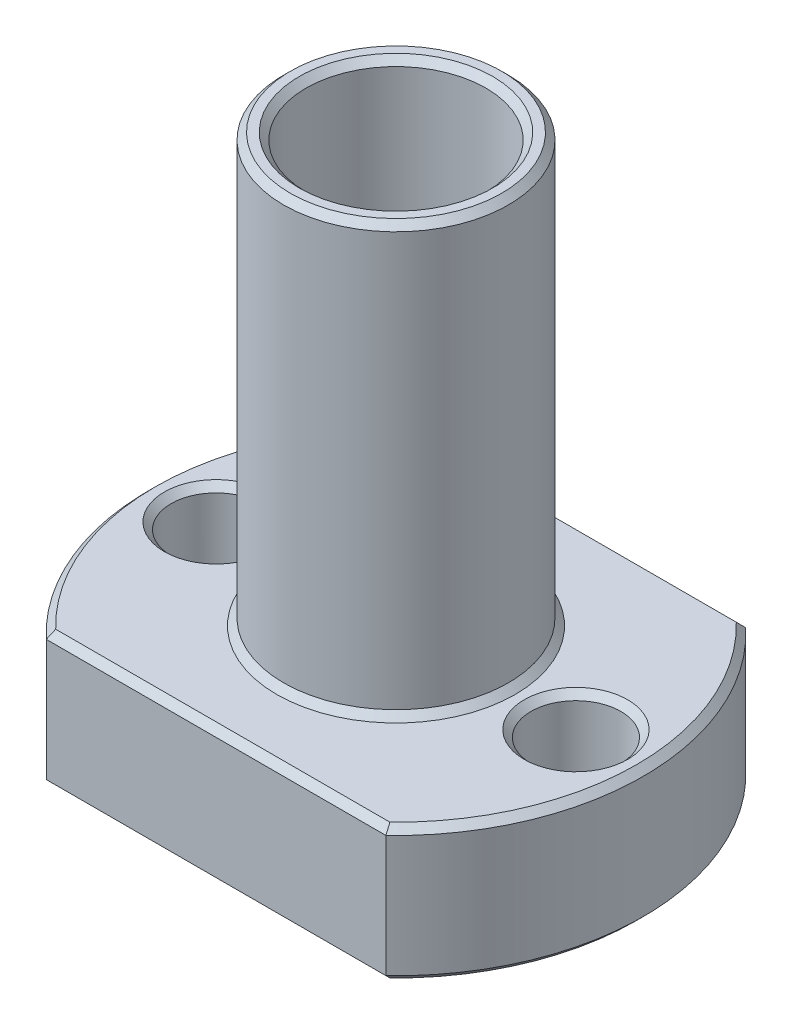
ISO-10303-21;
HEADER;
FILE_DESCRIPTION(('STEP AP214'),'2;1');
FILE_NAME('part.step','',(''),(''),'','','');
FILE_SCHEMA(('AUTOMOTIVE_DESIGN { 1 0 10303 214 1 1 1 1 }'));
ENDSEC;
DATA;
#1=APPLICATION_CONTEXT('core data for automotive mechanical design processes');
#2=APPLICATION_PROTOCOL_DEFINITION('international standard','automotive_design',2000,#1);
#3=PRODUCT_CONTEXT('',#1,'mechanical');
#4=PRODUCT('Part','Part','',(#3));
#5=PRODUCT_RELATED_PRODUCT_CATEGORY('part','',(#4));
#6=PRODUCT_DEFINITION_FORMATION('','',#4);
#7=PRODUCT_DEFINITION_CONTEXT('part definition',#1,'design');
#8=PRODUCT_DEFINITION('design','',#6,#7);
#9=PRODUCT_DEFINITION_SHAPE('','',#8);
#10=(LENGTH_UNIT() NAMED_UNIT(*) SI_UNIT(.MILLI.,.METRE.));
#11=(NAMED_UNIT(*) PLANE_ANGLE_UNIT() SI_UNIT($,.RADIAN.));
#12=(NAMED_UNIT(*) SI_UNIT($,.STERADIAN.) SOLID_ANGLE_UNIT());
#13=UNCERTAINTY_MEASURE_WITH_UNIT(LENGTH_MEASURE(1.E-05),#10,'distance_accuracy_value','');
#14=(GEOMETRIC_REPRESENTATION_CONTEXT(3) GLOBAL_UNCERTAINTY_ASSIGNED_CONTEXT((#13)) GLOBAL_UNIT_ASSIGNED_CONTEXT((#10,
#11,#12)) REPRESENTATION_CONTEXT('',''));
#15=CARTESIAN_POINT('',(0.,0.,0.));
#16=DIRECTION('',(0.,0.,1.));
#17=DIRECTION('',(1.,0.,0.));
#18=AXIS2_PLACEMENT_3D('',#15,#16,#17);
#19=CARTESIAN_POINT('',(0.,6.,0.));
#20=DIRECTION('',(0.,1.,0.));
#21=DIRECTION('',(0.,0.,1.));
#22=AXIS2_PLACEMENT_3D('',#19,#20,#21);
#23=PLANE('',#22);
#24=CARTESIAN_POINT('',(0.,6.,0.));
#25=DIRECTION('',(0.,1.,0.));
#26=DIRECTION('',(0.,0.,1.));
#27=AXIS2_PLACEMENT_3D('',#24,#25,#26);
#28=CIRCLE('',#27,5.3);
#29=CARTESIAN_POINT('',(0.,6.,5.3));
#30=VERTEX_POINT('',#29);
#31=EDGE_CURVE('E11',#30,#30,#28,.F.);
#32=ORIENTED_EDGE('',*,*,#31,.T.);
#33=EDGE_LOOP('',(#32));
#34=FACE_BOUND('',#33,.T.);
#35=CARTESIAN_POINT('',(-8.,6.,0.));
#36=DIRECTION('',(0.,1.,0.));
#37=DIRECTION('',(0.,0.,1.));
#38=AXIS2_PLACEMENT_3D('',#35,#36,#37);
#39=CIRCLE('',#38,2.29999999999999);
#40=CARTESIAN_POINT('',(-8.,6.,2.29999999999999));
#41=VERTEX_POINT('',#40);
#42=EDGE_CURVE('E46',#41,#41,#39,.F.);
#43=ORIENTED_EDGE('',*,*,#42,.T.);
#44=EDGE_LOOP('',(#43));
#45=FACE_BOUND('',#44,.T.);
#46=CARTESIAN_POINT('',(0.,6.,0.));
#47=DIRECTION('',(0.,1.,0.));
#48=DIRECTION('',(0.,0.,1.));
#49=AXIS2_PLACEMENT_3D('',#46,#47,#48);
#50=CIRCLE('',#49,10.7);
#51=CARTESIAN_POINT('',(-7.42967024840268,6.,-7.7));
#52=VERTEX_POINT('',#51);
#53=CARTESIAN_POINT('',(-7.42967024840269,6.,7.7));
#54=VERTEX_POINT('',#53);
#55=EDGE_CURVE('E54',#52,#54,#50,.T.);
#56=ORIENTED_EDGE('',*,*,#55,.T.);
#57=DIRECTION('',(1.,0.,0.));
#58=VECTOR('',#57,1.);
#59=CARTESIAN_POINT('',(7.54983443527075,6.,7.7));
#60=LINE('',#59,#58);
#61=CARTESIAN_POINT('',(7.42967024840268,6.,7.7));
#62=VERTEX_POINT('',#61);
#63=EDGE_CURVE('E195',#54,#62,#60,.T.);
#64=ORIENTED_EDGE('',*,*,#63,.T.);
#65=CARTESIAN_POINT('',(0.,6.,0.));
#66=DIRECTION('',(0.,1.,0.));
#67=DIRECTION('',(0.,0.,1.));
#68=AXIS2_PLACEMENT_3D('',#65,#66,#67);
#69=CIRCLE('',#68,10.7);
#70=CARTESIAN_POINT('',(7.42967024840268,6.,-7.7));
#71=VERTEX_POINT('',#70);
#72=EDGE_CURVE('E191',#62,#71,#69,.T.);
#73=ORIENTED_EDGE('',*,*,#72,.T.);
#74=DIRECTION('',(-1.,0.,0.));
#75=VECTOR('',#74,1.);
#76=CARTESIAN_POINT('',(-7.54983443527075,6.,-7.7));
#77=LINE('',#76,#75);
#78=EDGE_CURVE('E59',#71,#52,#77,.T.);
#79=ORIENTED_EDGE('',*,*,#78,.T.);
#80=EDGE_LOOP('',(#56,#64,#73,#79));
#81=FACE_BOUND('',#80,.T.);
#82=CARTESIAN_POINT('',(8.,6.,0.));
#83=DIRECTION('',(0.,1.,0.));
#84=DIRECTION('',(0.,0.,1.));
#85=AXIS2_PLACEMENT_3D('',#82,#83,#84);
#86=CIRCLE('',#85,2.29999999999999);
#87=CARTESIAN_POINT('',(8.,6.,2.29999999999999));
#88=VERTEX_POINT('',#87);
#89=EDGE_CURVE('E188',#88,#88,#86,.F.);
#90=ORIENTED_EDGE('',*,*,#89,.T.);
#91=EDGE_LOOP('',(#90));
#92=FACE_BOUND('',#91,.T.);
#93=ADVANCED_FACE('F33',(#34,#45,#81,#92),#23,.T.);
#94=CARTESIAN_POINT('',(0.,0.,0.));
#95=DIRECTION('',(0.,1.,0.));
#96=DIRECTION('',(0.,0.,1.));
#97=AXIS2_PLACEMENT_3D('',#94,#95,#96);
#98=PLANE('',#97);
#99=CARTESIAN_POINT('',(8.,0.,0.));
#100=DIRECTION('',(0.,1.,0.));
#101=DIRECTION('',(0.,0.,1.));
#102=AXIS2_PLACEMENT_3D('',#99,#100,#101);
#103=CIRCLE('',#102,2.3);
#104=CARTESIAN_POINT('',(8.,0.,2.3));
#105=VERTEX_POINT('',#104);
#106=EDGE_CURVE('E135',#105,#105,#103,.T.);
#107=ORIENTED_EDGE('',*,*,#106,.T.);
#108=EDGE_LOOP('',(#107));
#109=FACE_BOUND('',#108,.T.);
#110=CARTESIAN_POINT('',(0.,0.,0.));
#111=DIRECTION('',(0.,1.,0.));
#112=DIRECTION('',(0.,0.,1.));
#113=AXIS2_PLACEMENT_3D('',#110,#111,#112);
#114=CIRCLE('',#113,4.3);
#115=CARTESIAN_POINT('',(0.,0.,4.3));
#116=VERTEX_POINT('',#115);
#117=EDGE_CURVE('E132',#116,#116,#114,.T.);
#118=ORIENTED_EDGE('',*,*,#117,.T.);
#119=EDGE_LOOP('',(#118));
#120=FACE_BOUND('',#119,.T.);
#121=CARTESIAN_POINT('',(0.,0.,0.));
#122=DIRECTION('',(0.,1.,0.));
#123=DIRECTION('',(0.,0.,1.));
#124=AXIS2_PLACEMENT_3D('',#121,#122,#123);
#125=CIRCLE('',#124,10.7);
#126=CARTESIAN_POINT('',(-7.42967024840269,0.,7.7));
#127=VERTEX_POINT('',#126);
#128=CARTESIAN_POINT('',(-7.42967024840268,0.,-7.7));
#129=VERTEX_POINT('',#128);
#130=EDGE_CURVE('E131',#127,#129,#125,.F.);
#131=ORIENTED_EDGE('',*,*,#130,.T.);
#132=DIRECTION('',(1.,0.,0.));
#133=VECTOR('',#132,1.);
#134=CARTESIAN_POINT('',(0.,0.,-7.7));
#135=LINE('',#134,#133);
#136=CARTESIAN_POINT('',(7.42967024840268,0.,-7.7));
#137=VERTEX_POINT('',#136);
#138=EDGE_CURVE('E109',#129,#137,#135,.T.);
#139=ORIENTED_EDGE('',*,*,#138,.T.);
#140=CARTESIAN_POINT('',(0.,0.,0.));
#141=DIRECTION('',(0.,1.,0.));
#142=DIRECTION('',(0.,0.,1.));
#143=AXIS2_PLACEMENT_3D('',#140,#141,#142);
#144=CIRCLE('',#143,10.7);
#145=CARTESIAN_POINT('',(7.42967024840268,0.,7.7));
#146=VERTEX_POINT('',#145);
#147=EDGE_CURVE('E119',#137,#146,#144,.F.);
#148=ORIENTED_EDGE('',*,*,#147,.T.);
#149=DIRECTION('',(-1.,0.,0.));
#150=VECTOR('',#149,1.);
#151=CARTESIAN_POINT('',(0.,0.,7.7));
#152=LINE('',#151,#150);
#153=EDGE_CURVE('E125',#146,#127,#152,.T.);
#154=ORIENTED_EDGE('',*,*,#153,.T.);
#155=EDGE_LOOP('',(#131,#139,#148,#154));
#156=FACE_BOUND('',#155,.T.);
#157=CARTESIAN_POINT('',(-8.,0.,0.));
#158=DIRECTION('',(0.,1.,0.));
#159=DIRECTION('',(0.,0.,1.));
#160=AXIS2_PLACEMENT_3D('',#157,#158,#159);
#161=CIRCLE('',#160,2.3);
#162=CARTESIAN_POINT('',(-8.,0.,-2.3));
#163=VERTEX_POINT('',#162);
#164=EDGE_CURVE('E126',#163,#163,#161,.T.);
#165=ORIENTED_EDGE('',*,*,#164,.T.);
#166=EDGE_LOOP('',(#165));
#167=FACE_BOUND('',#166,.T.);
#168=ADVANCED_FACE('F128',(#109,#120,#156,#167),#98,.F.);
#169=CARTESIAN_POINT('',(0.,6.,0.));
#170=DIRECTION('',(0.,-1.,0.));
#171=DIRECTION('',(0.,0.,-1.));
#172=AXIS2_PLACEMENT_3D('',#169,#170,#171);
#173=CYLINDRICAL_SURFACE('',#172,11.);
#174=DIRECTION('',(0.,-1.,0.));
#175=VECTOR('',#174,1.);
#176=CARTESIAN_POINT('',(7.54983443527075,6.,8.));
#177=LINE('',#176,#175);
#178=CARTESIAN_POINT('',(7.54983443527075,5.7,8.));
#179=VERTEX_POINT('',#178);
#180=CARTESIAN_POINT('',(7.54983443527075,0.299999999999998,8.));
#181=VERTEX_POINT('',#180);
#182=EDGE_CURVE('E228',#179,#181,#177,.T.);
#183=ORIENTED_EDGE('',*,*,#182,.T.);
#184=CARTESIAN_POINT('',(0.,0.299999999999998,0.));
#185=DIRECTION('',(0.,1.,0.));
#186=DIRECTION('',(0.,0.,1.));
#187=AXIS2_PLACEMENT_3D('',#184,#185,#186);
#188=CIRCLE('',#187,11.);
#189=CARTESIAN_POINT('',(7.54983443527075,0.299999999999998,-8.));
#190=VERTEX_POINT('',#189);
#191=EDGE_CURVE('E168',#181,#190,#188,.T.);
#192=ORIENTED_EDGE('',*,*,#191,.T.);
#193=DIRECTION('',(0.,-1.,0.));
#194=VECTOR('',#193,1.);
#195=CARTESIAN_POINT('',(7.54983443527075,6.,-8.));
#196=LINE('',#195,#194);
#197=CARTESIAN_POINT('',(7.54983443527075,5.7,-8.));
#198=VERTEX_POINT('',#197);
#199=EDGE_CURVE('E291',#198,#190,#196,.T.);
#200=ORIENTED_EDGE('',*,*,#199,.F.);
#201=CARTESIAN_POINT('',(0.,5.7,0.));
#202=DIRECTION('',(0.,1.,0.));
#203=DIRECTION('',(0.,0.,1.));
#204=AXIS2_PLACEMENT_3D('',#201,#202,#203);
#205=CIRCLE('',#204,11.);
#206=EDGE_CURVE('E166',#198,#179,#205,.F.);
#207=ORIENTED_EDGE('',*,*,#206,.T.);
#208=EDGE_LOOP('',(#183,#192,#200,#207));
#209=FACE_BOUND('',#208,.T.);
#210=ADVANCED_FACE('F307',(#209),#173,.T.);
#211=CARTESIAN_POINT('',(7.54983443527075,6.,-8.));
#212=DIRECTION('',(0.,0.,1.));
#213=DIRECTION('',(1.,0.,0.));
#214=AXIS2_PLACEMENT_3D('',#211,#212,#213);
#215=PLANE('',#214);
#216=ORIENTED_EDGE('',*,*,#199,.T.);
#217=DIRECTION('',(-1.,0.,0.));
#218=VECTOR('',#217,1.);
#219=CARTESIAN_POINT('',(7.54983443527075,0.299999999999998,-8.));
#220=LINE('',#219,#218);
#221=CARTESIAN_POINT('',(-7.54983443527075,0.299999999999998,-8.));
#222=VERTEX_POINT('',#221);
#223=EDGE_CURVE('E112',#190,#222,#220,.T.);
#224=ORIENTED_EDGE('',*,*,#223,.T.);
#225=DIRECTION('',(0.,-1.,0.));
#226=VECTOR('',#225,1.);
#227=CARTESIAN_POINT('',(-7.54983443527075,6.,-8.));
#228=LINE('',#227,#226);
#229=CARTESIAN_POINT('',(-7.54983443527075,5.7,-8.));
#230=VERTEX_POINT('',#229);
#231=EDGE_CURVE('E289',#230,#222,#228,.T.);
#232=ORIENTED_EDGE('',*,*,#231,.F.);
#233=DIRECTION('',(1.,0.,0.));
#234=VECTOR('',#233,1.);
#235=CARTESIAN_POINT('',(7.54983443527075,5.7,-8.));
#236=LINE('',#235,#234);
#237=EDGE_CURVE('E154',#230,#198,#236,.T.);
#238=ORIENTED_EDGE('',*,*,#237,.T.);
#239=EDGE_LOOP('',(#216,#224,#232,#238));
#240=FACE_BOUND('',#239,.T.);
#241=ADVANCED_FACE('F303',(#240),#215,.F.);
#242=CARTESIAN_POINT('',(0.,6.,0.));
#243=DIRECTION('',(0.,-1.,0.));
#244=DIRECTION('',(0.,0.,-1.));
#245=AXIS2_PLACEMENT_3D('',#242,#243,#244);
#246=CYLINDRICAL_SURFACE('',#245,11.);
#247=ORIENTED_EDGE('',*,*,#231,.T.);
#248=CARTESIAN_POINT('',(0.,0.299999999999998,0.));
#249=DIRECTION('',(0.,1.,0.));
#250=DIRECTION('',(0.,0.,1.));
#251=AXIS2_PLACEMENT_3D('',#248,#249,#250);
#252=CIRCLE('',#251,11.);
#253=CARTESIAN_POINT('',(-7.54983443527076,0.299999999999998,7.99999999999999));
#254=VERTEX_POINT('',#253);
#255=EDGE_CURVE('E159',#222,#254,#252,.T.);
#256=ORIENTED_EDGE('',*,*,#255,.T.);
#257=DIRECTION('',(0.,-1.,0.));
#258=VECTOR('',#257,1.);
#259=CARTESIAN_POINT('',(-7.54983443527076,6.,7.99999999999999));
#260=LINE('',#259,#258);
#261=CARTESIAN_POINT('',(-7.54983443527076,5.7,7.99999999999999));
#262=VERTEX_POINT('',#261);
#263=EDGE_CURVE('E284',#262,#254,#260,.T.);
#264=ORIENTED_EDGE('',*,*,#263,.F.);
#265=CARTESIAN_POINT('',(0.,5.7,0.));
#266=DIRECTION('',(0.,1.,0.));
#267=DIRECTION('',(0.,0.,1.));
#268=AXIS2_PLACEMENT_3D('',#265,#266,#267);
#269=CIRCLE('',#268,11.);
#270=EDGE_CURVE('E157',#262,#230,#269,.F.);
#271=ORIENTED_EDGE('',*,*,#270,.T.);
#272=EDGE_LOOP('',(#247,#256,#264,#271));
#273=FACE_BOUND('',#272,.T.);
#274=ADVANCED_FACE('F287',(#273),#246,.T.);
#275=CARTESIAN_POINT('',(7.54983443527075,6.,8.));
#276=DIRECTION('',(0.,0.,-1.));
#277=DIRECTION('',(-1.,0.,0.));
#278=AXIS2_PLACEMENT_3D('',#275,#276,#277);
#279=PLANE('',#278);
#280=ORIENTED_EDGE('',*,*,#263,.T.);
#281=DIRECTION('',(1.,0.,0.));
#282=VECTOR('',#281,1.);
#283=CARTESIAN_POINT('',(7.54983443527075,0.299999999999998,8.));
#284=LINE('',#283,#282);
#285=EDGE_CURVE('E164',#254,#181,#284,.T.);
#286=ORIENTED_EDGE('',*,*,#285,.T.);
#287=ORIENTED_EDGE('',*,*,#182,.F.);
#288=DIRECTION('',(-1.,0.,0.));
#289=VECTOR('',#288,1.);
#290=CARTESIAN_POINT('',(-7.54983443527076,5.7,8.));
#291=LINE('',#290,#289);
#292=EDGE_CURVE('E161',#179,#262,#291,.T.);
#293=ORIENTED_EDGE('',*,*,#292,.T.);
#294=EDGE_LOOP('',(#280,#286,#287,#293));
#295=FACE_BOUND('',#294,.T.);
#296=ADVANCED_FACE('F283',(#295),#279,.F.);
#297=CARTESIAN_POINT('',(0.,6.,0.));
#298=DIRECTION('',(0.,-1.,0.));
#299=DIRECTION('',(0.,0.,-1.));
#300=AXIS2_PLACEMENT_3D('',#297,#298,#299);
#301=CYLINDRICAL_SURFACE('',#300,4.);
#302=CARTESIAN_POINT('',(0.,0.3,0.));
#303=DIRECTION('',(0.,1.,0.));
#304=DIRECTION('',(0.,0.,1.));
#305=AXIS2_PLACEMENT_3D('',#302,#303,#304);
#306=CIRCLE('',#305,4.);
#307=CARTESIAN_POINT('',(0.,0.3,4.));
#308=VERTEX_POINT('',#307);
#309=EDGE_CURVE('E151',#308,#308,#306,.F.);
#310=ORIENTED_EDGE('',*,*,#309,.T.);
#311=EDGE_LOOP('',(#310));
#312=FACE_BOUND('',#311,.T.);
#313=CARTESIAN_POINT('',(0.,24.7,0.));
#314=DIRECTION('',(0.,1.,0.));
#315=DIRECTION('',(0.,0.,1.));
#316=AXIS2_PLACEMENT_3D('',#313,#314,#315);
#317=CIRCLE('',#316,4.);
#318=CARTESIAN_POINT('',(0.,24.7,4.));
#319=VERTEX_POINT('',#318);
#320=EDGE_CURVE('E148',#319,#319,#317,.T.);
#321=ORIENTED_EDGE('',*,*,#320,.T.);
#322=EDGE_LOOP('',(#321));
#323=FACE_BOUND('',#322,.T.);
#324=ADVANCED_FACE('F331',(#312,#323),#301,.F.);
#325=CARTESIAN_POINT('',(-8.,6.,0.));
#326=DIRECTION('',(0.,-1.,0.));
#327=DIRECTION('',(0.,0.,-1.));
#328=AXIS2_PLACEMENT_3D('',#325,#326,#327);
#329=CYLINDRICAL_SURFACE('',#328,2.);
#330=CARTESIAN_POINT('',(-8.,0.300000000000005,0.));
#331=DIRECTION('',(0.,1.,0.));
#332=DIRECTION('',(0.,0.,1.));
#333=AXIS2_PLACEMENT_3D('',#330,#331,#332);
#334=CIRCLE('',#333,2.);
#335=CARTESIAN_POINT('',(-8.,0.300000000000005,-2.));
#336=VERTEX_POINT('',#335);
#337=EDGE_CURVE('E173',#336,#336,#334,.F.);
#338=ORIENTED_EDGE('',*,*,#337,.T.);
#339=EDGE_LOOP('',(#338));
#340=FACE_BOUND('',#339,.T.);
#341=CARTESIAN_POINT('',(-8.,5.70000000000001,0.));
#342=DIRECTION('',(0.,1.,0.));
#343=DIRECTION('',(0.,0.,1.));
#344=AXIS2_PLACEMENT_3D('',#341,#342,#343);
#345=CIRCLE('',#344,2.);
#346=CARTESIAN_POINT('',(-8.,5.70000000000001,2.));
#347=VERTEX_POINT('',#346);
#348=EDGE_CURVE('E170',#347,#347,#345,.T.);
#349=ORIENTED_EDGE('',*,*,#348,.T.);
#350=EDGE_LOOP('',(#349));
#351=FACE_BOUND('',#350,.T.);
#352=ADVANCED_FACE('F321',(#340,#351),#329,.F.);
#353=CARTESIAN_POINT('',(8.,6.,0.));
#354=DIRECTION('',(0.,-1.,0.));
#355=DIRECTION('',(0.,0.,-1.));
#356=AXIS2_PLACEMENT_3D('',#353,#354,#355);
#357=CYLINDRICAL_SURFACE('',#356,2.);
#358=CARTESIAN_POINT('',(8.,0.300000000000007,0.));
#359=DIRECTION('',(0.,1.,0.));
#360=DIRECTION('',(0.,0.,1.));
#361=AXIS2_PLACEMENT_3D('',#358,#359,#360);
#362=CIRCLE('',#361,2.);
#363=CARTESIAN_POINT('',(8.,0.300000000000007,2.));
#364=VERTEX_POINT('',#363);
#365=EDGE_CURVE('E145',#364,#364,#362,.F.);
#366=ORIENTED_EDGE('',*,*,#365,.T.);
#367=EDGE_LOOP('',(#366));
#368=FACE_BOUND('',#367,.T.);
#369=CARTESIAN_POINT('',(8.,5.70000000000001,0.));
#370=DIRECTION('',(0.,1.,0.));
#371=DIRECTION('',(0.,0.,1.));
#372=AXIS2_PLACEMENT_3D('',#369,#370,#371);
#373=CIRCLE('',#372,2.);
#374=CARTESIAN_POINT('',(8.,5.70000000000001,2.));
#375=VERTEX_POINT('',#374);
#376=EDGE_CURVE('E142',#375,#375,#373,.T.);
#377=ORIENTED_EDGE('',*,*,#376,.T.);
#378=EDGE_LOOP('',(#377));
#379=FACE_BOUND('',#378,.T.);
#380=ADVANCED_FACE('F318',(#368,#379),#357,.F.);
#381=CARTESIAN_POINT('',(0.,25.,0.));
#382=DIRECTION('',(0.,1.,0.));
#383=DIRECTION('',(0.,0.,1.));
#384=AXIS2_PLACEMENT_3D('',#381,#382,#383);
#385=PLANE('',#384);
#386=CARTESIAN_POINT('',(0.,25.,0.));
#387=DIRECTION('',(0.,1.,0.));
#388=DIRECTION('',(0.,0.,1.));
#389=AXIS2_PLACEMENT_3D('',#386,#387,#388);
#390=CIRCLE('',#389,4.3);
#391=CARTESIAN_POINT('',(0.,25.,4.3));
#392=VERTEX_POINT('',#391);
#393=EDGE_CURVE('E179',#392,#392,#390,.F.);
#394=ORIENTED_EDGE('',*,*,#393,.T.);
#395=EDGE_LOOP('',(#394));
#396=FACE_BOUND('',#395,.T.);
#397=CARTESIAN_POINT('',(0.,25.,0.));
#398=DIRECTION('',(0.,1.,0.));
#399=DIRECTION('',(0.,0.,1.));
#400=AXIS2_PLACEMENT_3D('',#397,#398,#399);
#401=CIRCLE('',#400,4.7);
#402=CARTESIAN_POINT('',(0.,25.,4.7));
#403=VERTEX_POINT('',#402);
#404=EDGE_CURVE('E176',#403,#403,#401,.T.);
#405=ORIENTED_EDGE('',*,*,#404,.T.);
#406=EDGE_LOOP('',(#405));
#407=FACE_BOUND('',#406,.T.);
#408=ADVANCED_FACE('F320',(#396,#407),#385,.T.);
#409=CARTESIAN_POINT('',(0.,25.,0.));
#410=DIRECTION('',(0.,-1.,0.));
#411=DIRECTION('',(0.,0.,-1.));
#412=AXIS2_PLACEMENT_3D('',#409,#410,#411);
#413=CYLINDRICAL_SURFACE('',#412,5.);
#414=CARTESIAN_POINT('',(0.,24.7,0.));
#415=DIRECTION('',(0.,1.,0.));
#416=DIRECTION('',(0.,0.,1.));
#417=AXIS2_PLACEMENT_3D('',#414,#415,#416);
#418=CIRCLE('',#417,5.);
#419=CARTESIAN_POINT('',(0.,24.7,5.));
#420=VERTEX_POINT('',#419);
#421=EDGE_CURVE('E185',#420,#420,#418,.F.);
#422=ORIENTED_EDGE('',*,*,#421,.T.);
#423=EDGE_LOOP('',(#422));
#424=FACE_BOUND('',#423,.T.);
#425=CARTESIAN_POINT('',(0.,6.30000000000001,0.));
#426=DIRECTION('',(0.,1.,0.));
#427=DIRECTION('',(0.,0.,1.));
#428=AXIS2_PLACEMENT_3D('',#425,#426,#427);
#429=CIRCLE('',#428,5.);
#430=CARTESIAN_POINT('',(0.,6.30000000000001,5.));
#431=VERTEX_POINT('',#430);
#432=EDGE_CURVE('E182',#431,#431,#429,.T.);
#433=ORIENTED_EDGE('',*,*,#432,.T.);
#434=EDGE_LOOP('',(#433));
#435=FACE_BOUND('',#434,.T.);
#436=ADVANCED_FACE('F328',(#424,#435),#413,.T.);
#437=CARTESIAN_POINT('',(8.,0.,0.));
#438=DIRECTION('',(0.,-1.,0.));
#439=DIRECTION('',(0.,0.,-1.));
#440=AXIS2_PLACEMENT_3D('',#437,#438,#439);
#441=CONICAL_SURFACE('',#440,2.3,0.785398163397443);
#442=ORIENTED_EDGE('',*,*,#365,.F.);
#443=EDGE_LOOP('',(#442));
#444=FACE_BOUND('',#443,.T.);
#445=ORIENTED_EDGE('',*,*,#106,.F.);
#446=EDGE_LOOP('',(#445));
#447=FACE_BOUND('',#446,.T.);
#448=ADVANCED_FACE('F350',(#444,#447),#441,.F.);
#449=CARTESIAN_POINT('',(0.,0.,0.));
#450=DIRECTION('',(0.,-1.,0.));
#451=DIRECTION('',(0.,0.,-1.));
#452=AXIS2_PLACEMENT_3D('',#449,#450,#451);
#453=CONICAL_SURFACE('',#452,4.3,0.785398163397445);
#454=ORIENTED_EDGE('',*,*,#309,.F.);
#455=EDGE_LOOP('',(#454));
#456=FACE_BOUND('',#455,.T.);
#457=ORIENTED_EDGE('',*,*,#117,.F.);
#458=EDGE_LOOP('',(#457));
#459=FACE_BOUND('',#458,.T.);
#460=ADVANCED_FACE('F352',(#456,#459),#453,.F.);
#461=CARTESIAN_POINT('',(7.54983443527075,0.299999999999998,8.));
#462=DIRECTION('',(0.,0.70710678118655,-0.707106781186545));
#463=DIRECTION('',(1.,0.,0.));
#464=AXIS2_PLACEMENT_3D('',#461,#462,#463);
#465=PLANE('',#464);
#466=CARTESIAN_POINT('',(-7.54983443527076,0.299999999999998,7.99999999999999));
#467=CARTESIAN_POINT('',(-7.52995579595874,0.249970215094772,7.94997021509477));
#468=CARTESIAN_POINT('',(-7.51000279421797,0.199955323024184,7.89995532302418));
#469=CARTESIAN_POINT('',(-7.46994806526649,0.0999553230232741,7.79995532302327));
#470=CARTESIAN_POINT('',(-7.44984633805124,0.0499702150938623,7.74997021509386));
#471=CARTESIAN_POINT('',(-7.42967024840269,0.,7.7));
#472=B_SPLINE_CURVE_WITH_KNOTS('',3,(#466,#467,#468,#469,#470,#471),.UNSPECIFIED.,.F.,.F.,(4,2,
4),(0.,0.220476552551942,0.440953111846116),.UNSPECIFIED.);
#473=EDGE_CURVE('E115',#127,#254,#472,.F.);
#474=ORIENTED_EDGE('',*,*,#473,.F.);
#475=ORIENTED_EDGE('',*,*,#153,.F.);
#476=CARTESIAN_POINT('',(7.54983443527075,0.299999999999998,8.));
#477=CARTESIAN_POINT('',(7.52995579595873,0.249970215094771,7.94997021509477));
#478=CARTESIAN_POINT('',(7.51000279421796,0.199955323024184,7.89995532302419));
#479=CARTESIAN_POINT('',(7.46994806526649,0.0999553230232735,7.79995532302327));
#480=CARTESIAN_POINT('',(7.44984633805123,0.0499702150938617,7.74997021509386));
#481=CARTESIAN_POINT('',(7.42967024840268,0.,7.7));
#482=B_SPLINE_CURVE_WITH_KNOTS('',3,(#476,#477,#478,#479,#480,#481),.UNSPECIFIED.,.F.,.F.,(4,2,
4),(0.,0.220476552551943,0.440953111846117),.UNSPECIFIED.);
#483=EDGE_CURVE('E122',#181,#146,#482,.T.);
#484=ORIENTED_EDGE('',*,*,#483,.F.);
#485=ORIENTED_EDGE('',*,*,#285,.F.);
#486=EDGE_LOOP('',(#474,#475,#484,#485));
#487=FACE_BOUND('',#486,.T.);
#488=ADVANCED_FACE('F219',(#487),#465,.F.);
#489=CARTESIAN_POINT('',(0.,0.299999999999998,0.));
#490=DIRECTION('',(0.,1.,0.));
#491=DIRECTION('',(0.,0.,1.));
#492=AXIS2_PLACEMENT_3D('',#489,#490,#491);
#493=CONICAL_SURFACE('',#492,11.,0.785398163397451);
#494=ORIENTED_EDGE('',*,*,#483,.T.);
#495=ORIENTED_EDGE('',*,*,#147,.F.);
#496=CARTESIAN_POINT('',(7.42967024840268,0.,-7.7));
#497=CARTESIAN_POINT('',(7.44984633805123,0.0499702150938617,-7.74997021509386));
#498=CARTESIAN_POINT('',(7.46994806526649,0.0999553230232735,-7.79995532302327));
#499=CARTESIAN_POINT('',(7.51000279421796,0.199955323024184,-7.89995532302419));
#500=CARTESIAN_POINT('',(7.52995579595873,0.249970215094771,-7.94997021509477));
#501=CARTESIAN_POINT('',(7.54983443527075,0.299999999999998,-8.));
#502=B_SPLINE_CURVE_WITH_KNOTS('',3,(#496,#497,#498,#499,#500,#501),.UNSPECIFIED.,.F.,.F.,(4,2,
4),(0.,0.220476559294174,0.440953111846117),.UNSPECIFIED.);
#503=EDGE_CURVE('E105',#190,#137,#502,.F.);
#504=ORIENTED_EDGE('',*,*,#503,.F.);
#505=ORIENTED_EDGE('',*,*,#191,.F.);
#506=EDGE_LOOP('',(#494,#495,#504,#505));
#507=FACE_BOUND('',#506,.T.);
#508=ADVANCED_FACE('F120',(#507),#493,.T.);
#509=CARTESIAN_POINT('',(0.,0.299999999999998,0.));
#510=DIRECTION('',(0.,1.,0.));
#511=DIRECTION('',(0.,0.,1.));
#512=AXIS2_PLACEMENT_3D('',#509,#510,#511);
#513=CONICAL_SURFACE('',#512,11.,0.785398163397451);
#514=ORIENTED_EDGE('',*,*,#473,.T.);
#515=ORIENTED_EDGE('',*,*,#255,.F.);
#516=CARTESIAN_POINT('',(-7.54983443527075,0.299999999999998,-8.));
#517=CARTESIAN_POINT('',(-7.52995579595873,0.249970215094771,-7.94997021509477));
#518=CARTESIAN_POINT('',(-7.51000279421796,0.199955323024183,-7.89995532302419));
#519=CARTESIAN_POINT('',(-7.46994806526649,0.099955323023273,-7.79995532302327));
#520=CARTESIAN_POINT('',(-7.44984633805123,0.0499702150938611,-7.74997021509386));
#521=CARTESIAN_POINT('',(-7.42967024840268,0.,-7.7));
#522=B_SPLINE_CURVE_WITH_KNOTS('',3,(#516,#517,#518,#519,#520,#521),.UNSPECIFIED.,.F.,.F.,(4,2,
4),(0.,0.220476552551943,0.440953111846119),.UNSPECIFIED.);
#523=EDGE_CURVE('E116',#129,#222,#522,.F.);
#524=ORIENTED_EDGE('',*,*,#523,.F.);
#525=ORIENTED_EDGE('',*,*,#130,.F.);
#526=EDGE_LOOP('',(#514,#515,#524,#525));
#527=FACE_BOUND('',#526,.T.);
#528=ADVANCED_FACE('F209',(#527),#513,.T.);
#529=CARTESIAN_POINT('',(7.54983443527075,0.299999999999998,-8.));
#530=DIRECTION('',(0.,0.70710678118655,0.707106781186545));
#531=DIRECTION('',(-1.,0.,0.));
#532=AXIS2_PLACEMENT_3D('',#529,#530,#531);
#533=PLANE('',#532);
#534=ORIENTED_EDGE('',*,*,#503,.T.);
#535=ORIENTED_EDGE('',*,*,#138,.F.);
#536=ORIENTED_EDGE('',*,*,#523,.T.);
#537=ORIENTED_EDGE('',*,*,#223,.F.);
#538=EDGE_LOOP('',(#534,#535,#536,#537));
#539=FACE_BOUND('',#538,.T.);
#540=ADVANCED_FACE('F107',(#539),#533,.F.);
#541=CARTESIAN_POINT('',(-8.,0.,0.));
#542=DIRECTION('',(0.,-1.,0.));
#543=DIRECTION('',(0.,0.,-1.));
#544=AXIS2_PLACEMENT_3D('',#541,#542,#543);
#545=CONICAL_SURFACE('',#544,2.3,0.785398163397445);
#546=CARTESIAN_POINT('',(-8.,0.300000000000005,-2.));
#547=CARTESIAN_POINT('',(-8.,0.296875000000005,-2.003125));
#548=CARTESIAN_POINT('',(-8.,0.293750000000005,-2.00625));
#549=CARTESIAN_POINT('',(-8.,0.287500000000005,-2.0125));
#550=CARTESIAN_POINT('',(-8.,0.284375000000005,-2.015625));
#551=CARTESIAN_POINT('',(-8.,0.278125000000005,-2.021875));
#552=CARTESIAN_POINT('',(-8.,0.275000000000005,-2.025));
#553=CARTESIAN_POINT('',(-8.,0.268750000000005,-2.03125));
#554=CARTESIAN_POINT('',(-8.,0.265625000000004,-2.034375));
#555=CARTESIAN_POINT('',(-8.,0.259375000000004,-2.040625));
#556=CARTESIAN_POINT('',(-8.,0.256250000000004,-2.04375));
#557=CARTESIAN_POINT('',(-8.,0.250000000000004,-2.05));
#558=CARTESIAN_POINT('',(-8.,0.246875000000004,-2.053125));
#559=CARTESIAN_POINT('',(-8.,0.240625000000004,-2.059375));
#560=CARTESIAN_POINT('',(-8.,0.237500000000004,-2.0625));
#561=CARTESIAN_POINT('',(-8.,0.231250000000004,-2.06875));
#562=CARTESIAN_POINT('',(-8.,0.228125000000004,-2.071875));
#563=CARTESIAN_POINT('',(-8.,0.221875000000004,-2.078125));
#564=CARTESIAN_POINT('',(-8.,0.218750000000004,-2.08125));
#565=CARTESIAN_POINT('',(-8.,0.212500000000004,-2.0875));
#566=CARTESIAN_POINT('',(-8.,0.209375000000004,-2.090625));
#567=CARTESIAN_POINT('',(-8.,0.203125000000003,-2.096875));
#568=CARTESIAN_POINT('',(-8.,0.200000000000003,-2.1));
#569=CARTESIAN_POINT('',(-8.,0.193750000000003,-2.10625));
#570=CARTESIAN_POINT('',(-8.,0.190625000000003,-2.109375));
#571=CARTESIAN_POINT('',(-8.,0.184375000000003,-2.115625));
#572=CARTESIAN_POINT('',(-8.,0.181250000000003,-2.11875));
#573=CARTESIAN_POINT('',(-8.,0.175000000000003,-2.125));
#574=CARTESIAN_POINT('',(-8.,0.171875000000003,-2.128125));
#575=CARTESIAN_POINT('',(-8.,0.165625000000003,-2.134375));
#576=CARTESIAN_POINT('',(-8.,0.162500000000003,-2.1375));
#577=CARTESIAN_POINT('',(-8.,0.156250000000003,-2.14375));
#578=CARTESIAN_POINT('',(-8.,0.153125000000003,-2.146875));
#579=CARTESIAN_POINT('',(-8.,0.146875000000002,-2.153125));
#580=CARTESIAN_POINT('',(-8.,0.143750000000002,-2.15625));
#581=CARTESIAN_POINT('',(-8.,0.137500000000002,-2.1625));
#582=CARTESIAN_POINT('',(-8.,0.134375000000002,-2.165625));
#583=CARTESIAN_POINT('',(-8.,0.128125000000002,-2.171875));
#584=CARTESIAN_POINT('',(-8.,0.125000000000002,-2.175));
#585=CARTESIAN_POINT('',(-8.,0.118750000000002,-2.18125));
#586=CARTESIAN_POINT('',(-8.,0.115625000000002,-2.184375));
#587=CARTESIAN_POINT('',(-8.,0.109375000000002,-2.190625));
#588=CARTESIAN_POINT('',(-8.,0.106250000000002,-2.19375));
#589=CARTESIAN_POINT('',(-8.,0.100000000000002,-2.2));
#590=CARTESIAN_POINT('',(-8.,0.0968750000000016,-2.203125));
#591=CARTESIAN_POINT('',(-8.,0.0906250000000016,-2.209375));
#592=CARTESIAN_POINT('',(-8.,0.0875000000000015,-2.2125));
#593=CARTESIAN_POINT('',(-8.,0.0812500000000014,-2.21875));
#594=CARTESIAN_POINT('',(-8.,0.0781250000000013,-2.221875));
#595=CARTESIAN_POINT('',(-8.,0.0718750000000012,-2.228125));
#596=CARTESIAN_POINT('',(-8.,0.0687500000000012,-2.23125));
#597=CARTESIAN_POINT('',(-8.,0.0625000000000011,-2.2375));
#598=CARTESIAN_POINT('',(-8.,0.059375000000001,-2.240625));
#599=CARTESIAN_POINT('',(-8.,0.0531250000000009,-2.246875));
#600=CARTESIAN_POINT('',(-8.,0.0500000000000008,-2.25));
#601=CARTESIAN_POINT('',(-8.,0.0437500000000008,-2.25625));
#602=CARTESIAN_POINT('',(-8.,0.0406250000000007,-2.259375));
#603=CARTESIAN_POINT('',(-8.,0.0343750000000006,-2.265625));
#604=CARTESIAN_POINT('',(-8.,0.0312500000000005,-2.26875));
#605=CARTESIAN_POINT('',(-8.,0.0250000000000004,-2.275));
#606=CARTESIAN_POINT('',(-8.,0.0218750000000004,-2.278125));
#607=CARTESIAN_POINT('',(-8.,0.0156250000000003,-2.284375));
#608=CARTESIAN_POINT('',(-8.,0.0125000000000002,-2.2875));
#609=CARTESIAN_POINT('',(-8.,0.00625000000000003,-2.29375));
#610=CARTESIAN_POINT('',(-8.,0.00312499999999993,-2.296875));
#611=CARTESIAN_POINT('',(-8.,0.,-2.3));
#612=B_SPLINE_CURVE_WITH_KNOTS('',3,(#546,#547,#548,#549,#550,#551,#552,#553,#554,#555,#556,
#557,#558,#559,#560,#561,#562,#563,#564,#565,#566,#567,#568,#569,#570,#571,#572,#573,#574,#575,
#576,#577,#578,#579,#580,#581,#582,#583,#584,#585,#586,#587,#588,#589,#590,#591,#592,#593,#594,
#595,#596,#597,#598,#599,#600,#601,#602,#603,#604,#605,#606,#607,#608,#609,#610,#611),
.UNSPECIFIED.,.F.,.F.,(4,2,2,2,2,2,2,2,2,2,2,2,2,2,2,2,2,2,2,2,2,2,2,2,2,2,2,2,2,2,2,2,4),(0.,
0.0132582521472481,0.0265165042944958,0.0397747564417439,0.0530330085889917,0.0662912607362397,
0.0795495128834878,0.0928077650307355,0.106066017177984,0.119324269325231,0.132582521472479,
0.145840773619728,0.159099025766975,0.172357277914223,0.185615530061471,0.198873782208719,
0.212132034355967,0.225390286503215,0.238648538650463,0.251906790797711,0.265165042944959,
0.278423295092207,0.291681547239455,0.304939799386703,0.318198051533951,0.331456303681199,
0.344714555828446,0.357972807975694,0.371231060122942,0.38448931227019,0.397747564417438,
0.411005816564686,0.424264068711934),.UNSPECIFIED.);
#613=EDGE_CURVE('BSEAM214',#336,#163,#612,.T.);
#614=ORIENTED_EDGE('',*,*,#337,.F.);
#615=ORIENTED_EDGE('',*,*,#164,.F.);
#616=ORIENTED_EDGE('',*,*,#613,.T.);
#617=ORIENTED_EDGE('',*,*,#613,.F.);
#618=EDGE_LOOP('',(#614,#616,#615,#617));
#619=FACE_BOUND('',#618,.T.);
#620=ADVANCED_FACE('F214',(#619),#545,.F.);
#621=CARTESIAN_POINT('',(0.,24.7,0.));
#622=DIRECTION('',(0.,1.,0.));
#623=DIRECTION('',(0.,0.,1.));
#624=AXIS2_PLACEMENT_3D('',#621,#622,#623);
#625=CONICAL_SURFACE('',#624,4.,0.785398163397448);
#626=ORIENTED_EDGE('',*,*,#393,.F.);
#627=EDGE_LOOP('',(#626));
#628=FACE_BOUND('',#627,.T.);
#629=ORIENTED_EDGE('',*,*,#320,.F.);
#630=EDGE_LOOP('',(#629));
#631=FACE_BOUND('',#630,.T.);
#632=ADVANCED_FACE('F366',(#628,#631),#625,.F.);
#633=CARTESIAN_POINT('',(0.,25.,0.));
#634=DIRECTION('',(0.,-1.,0.));
#635=DIRECTION('',(0.,0.,-1.));
#636=AXIS2_PLACEMENT_3D('',#633,#634,#635);
#637=CONICAL_SURFACE('',#636,4.7,0.785398163397447);
#638=ORIENTED_EDGE('',*,*,#421,.F.);
#639=EDGE_LOOP('',(#638));
#640=FACE_BOUND('',#639,.T.);
#641=ORIENTED_EDGE('',*,*,#404,.F.);
#642=EDGE_LOOP('',(#641));
#643=FACE_BOUND('',#642,.T.);
#644=ADVANCED_FACE('F368',(#640,#643),#637,.T.);
#645=CARTESIAN_POINT('',(0.,6.30000000000001,0.));
#646=DIRECTION('',(0.,-1.,0.));
#647=DIRECTION('',(0.,0.,-1.));
#648=AXIS2_PLACEMENT_3D('',#645,#646,#647);
#649=CONICAL_SURFACE('',#648,5.,0.785398163397432);
#650=ORIENTED_EDGE('',*,*,#31,.F.);
#651=EDGE_LOOP('',(#650));
#652=FACE_BOUND('',#651,.T.);
#653=ORIENTED_EDGE('',*,*,#432,.F.);
#654=EDGE_LOOP('',(#653));
#655=FACE_BOUND('',#654,.T.);
#656=ADVANCED_FACE('F375',(#652,#655),#649,.T.);
#657=CARTESIAN_POINT('',(-8.,5.70000000000001,0.));
#658=DIRECTION('',(0.,1.,0.));
#659=DIRECTION('',(0.,0.,1.));
#660=AXIS2_PLACEMENT_3D('',#657,#658,#659);
#661=CONICAL_SURFACE('',#660,2.,0.785398163397448);
#662=ORIENTED_EDGE('',*,*,#42,.F.);
#663=EDGE_LOOP('',(#662));
#664=FACE_BOUND('',#663,.T.);
#665=ORIENTED_EDGE('',*,*,#348,.F.);
#666=EDGE_LOOP('',(#665));
#667=FACE_BOUND('',#666,.T.);
#668=ADVANCED_FACE('F259',(#664,#667),#661,.F.);
#669=CARTESIAN_POINT('',(0.,6.,-7.7));
#670=DIRECTION('',(0.,0.707106781186547,-0.707106781186547));
#671=DIRECTION('',(1.,0.,0.));
#672=AXIS2_PLACEMENT_3D('',#669,#670,#671);
#673=PLANE('',#672);
#674=CARTESIAN_POINT('',(7.54983443527075,5.7,-8.));
#675=CARTESIAN_POINT('',(7.52995579595873,5.75002978490523,-7.94997021509477));
#676=CARTESIAN_POINT('',(7.51000279421796,5.80004467697582,-7.89995532302419));
#677=CARTESIAN_POINT('',(7.46994806526649,5.90004467697673,-7.79995532302327));
#678=CARTESIAN_POINT('',(7.44984633805123,5.95002978490614,-7.74997021509386));
#679=CARTESIAN_POINT('',(7.42967024840268,6.,-7.7));
#680=B_SPLINE_CURVE_WITH_KNOTS('',3,(#674,#675,#676,#677,#678,#679),.UNSPECIFIED.,.F.,.F.,(4,2,
4),(0.,0.220476552551944,0.440953111846119),.UNSPECIFIED.);
#681=EDGE_CURVE('E262',#198,#71,#680,.T.);
#682=ORIENTED_EDGE('',*,*,#681,.F.);
#683=ORIENTED_EDGE('',*,*,#237,.F.);
#684=CARTESIAN_POINT('',(-7.54983443527075,5.7,-8.));
#685=CARTESIAN_POINT('',(-7.52995579595873,5.75002978490523,-7.94997021509477));
#686=CARTESIAN_POINT('',(-7.51000279421796,5.80004467697581,-7.89995532302419));
#687=CARTESIAN_POINT('',(-7.46994806526649,5.90004467697672,-7.79995532302328));
#688=CARTESIAN_POINT('',(-7.44984633805123,5.95002978490614,-7.74997021509386));
#689=CARTESIAN_POINT('',(-7.42967024840268,6.,-7.7));
#690=B_SPLINE_CURVE_WITH_KNOTS('',3,(#684,#685,#686,#687,#688,#689),.UNSPECIFIED.,.F.,.F.,(4,2,
4),(0.,0.220476552551942,0.440953111846117),.UNSPECIFIED.);
#691=EDGE_CURVE('E37',#52,#230,#690,.F.);
#692=ORIENTED_EDGE('',*,*,#691,.F.);
#693=ORIENTED_EDGE('',*,*,#78,.F.);
#694=EDGE_LOOP('',(#682,#683,#692,#693));
#695=FACE_BOUND('',#694,.T.);
#696=ADVANCED_FACE('F254',(#695),#673,.T.);
#697=CARTESIAN_POINT('',(0.,6.,0.));
#698=DIRECTION('',(0.,-1.,0.));
#699=DIRECTION('',(0.,0.,-1.));
#700=AXIS2_PLACEMENT_3D('',#697,#698,#699);
#701=CONICAL_SURFACE('',#700,10.7,0.785398163397448);
#702=ORIENTED_EDGE('',*,*,#691,.T.);
#703=ORIENTED_EDGE('',*,*,#270,.F.);
#704=CARTESIAN_POINT('',(-7.54983443527076,5.7,7.99999999999999));
#705=CARTESIAN_POINT('',(-7.52995579595874,5.75002978490523,7.94997021509477));
#706=CARTESIAN_POINT('',(-7.51000279421797,5.80004467697581,7.89995532302418));
#707=CARTESIAN_POINT('',(-7.46994806526649,5.90004467697673,7.79995532302327));
#708=CARTESIAN_POINT('',(-7.44984633805124,5.95002978490614,7.74997021509386));
#709=CARTESIAN_POINT('',(-7.42967024840269,6.,7.7));
#710=B_SPLINE_CURVE_WITH_KNOTS('',3,(#704,#705,#706,#707,#708,#709),.UNSPECIFIED.,.F.,.F.,(4,2,
4),(0.,0.220476552551942,0.440953111846118),.UNSPECIFIED.);
#711=EDGE_CURVE('E239',#54,#262,#710,.F.);
#712=ORIENTED_EDGE('',*,*,#711,.F.);
#713=ORIENTED_EDGE('',*,*,#55,.F.);
#714=EDGE_LOOP('',(#702,#703,#712,#713));
#715=FACE_BOUND('',#714,.T.);
#716=ADVANCED_FACE('F250',(#715),#701,.T.);
#717=CARTESIAN_POINT('',(0.,6.,0.));
#718=DIRECTION('',(0.,-1.,0.));
#719=DIRECTION('',(0.,0.,-1.));
#720=AXIS2_PLACEMENT_3D('',#717,#718,#719);
#721=CONICAL_SURFACE('',#720,10.7,0.785398163397448);
#722=ORIENTED_EDGE('',*,*,#681,.T.);
#723=ORIENTED_EDGE('',*,*,#72,.F.);
#724=CARTESIAN_POINT('',(7.42967024840268,6.,7.7));
#725=CARTESIAN_POINT('',(7.44984633805123,5.95002978490614,7.74997021509386));
#726=CARTESIAN_POINT('',(7.46994806526649,5.90004467697673,7.79995532302327));
#727=CARTESIAN_POINT('',(7.51000279421796,5.80004467697582,7.89995532302419));
#728=CARTESIAN_POINT('',(7.52995579595873,5.75002978490523,7.94997021509477));
#729=CARTESIAN_POINT('',(7.54983443527075,5.7,8.));
#730=B_SPLINE_CURVE_WITH_KNOTS('',3,(#724,#725,#726,#727,#728,#729),.UNSPECIFIED.,.F.,.F.,(4,2,
4),(0.,0.220476559294175,0.440953111846118),.UNSPECIFIED.);
#731=EDGE_CURVE('E232',#179,#62,#730,.F.);
#732=ORIENTED_EDGE('',*,*,#731,.F.);
#733=ORIENTED_EDGE('',*,*,#206,.F.);
#734=EDGE_LOOP('',(#722,#723,#732,#733));
#735=FACE_BOUND('',#734,.T.);
#736=ADVANCED_FACE('F243',(#735),#721,.T.);
#737=CARTESIAN_POINT('',(0.,6.,7.7));
#738=DIRECTION('',(0.,0.707106781186547,0.707106781186547));
#739=DIRECTION('',(-1.,0.,0.));
#740=AXIS2_PLACEMENT_3D('',#737,#738,#739);
#741=PLANE('',#740);
#742=ORIENTED_EDGE('',*,*,#711,.T.);
#743=ORIENTED_EDGE('',*,*,#292,.F.);
#744=ORIENTED_EDGE('',*,*,#731,.T.);
#745=ORIENTED_EDGE('',*,*,#63,.F.);
#746=EDGE_LOOP('',(#742,#743,#744,#745));
#747=FACE_BOUND('',#746,.T.);
#748=ADVANCED_FACE('F246',(#747),#741,.T.);
#749=CARTESIAN_POINT('',(8.,5.70000000000001,0.));
#750=DIRECTION('',(0.,1.,0.));
#751=DIRECTION('',(0.,0.,1.));
#752=AXIS2_PLACEMENT_3D('',#749,#750,#751);
#753=CONICAL_SURFACE('',#752,2.,0.785398163397446);
#754=ORIENTED_EDGE('',*,*,#89,.F.);
#755=EDGE_LOOP('',(#754));
#756=FACE_BOUND('',#755,.T.);
#757=ORIENTED_EDGE('',*,*,#376,.F.);
#758=EDGE_LOOP('',(#757));
#759=FACE_BOUND('',#758,.T.);
#760=ADVANCED_FACE('F35',(#756,#759),#753,.F.);
#761=CLOSED_SHELL('',(#93,#168,#210,#241,#274,#296,#324,#352,#380,#408,#436,#448,#460,#488,#508,
#528,#540,#620,#632,#644,#656,#668,#696,#716,#736,#748,#760));
#762=MANIFOLD_SOLID_BREP('B2',#761);
#763=ADVANCED_BREP_SHAPE_REPRESENTATION('',(#18,#762),#14);
#764=SHAPE_DEFINITION_REPRESENTATION(#9,#763);
ENDSEC;
END-ISO-10303-21;
